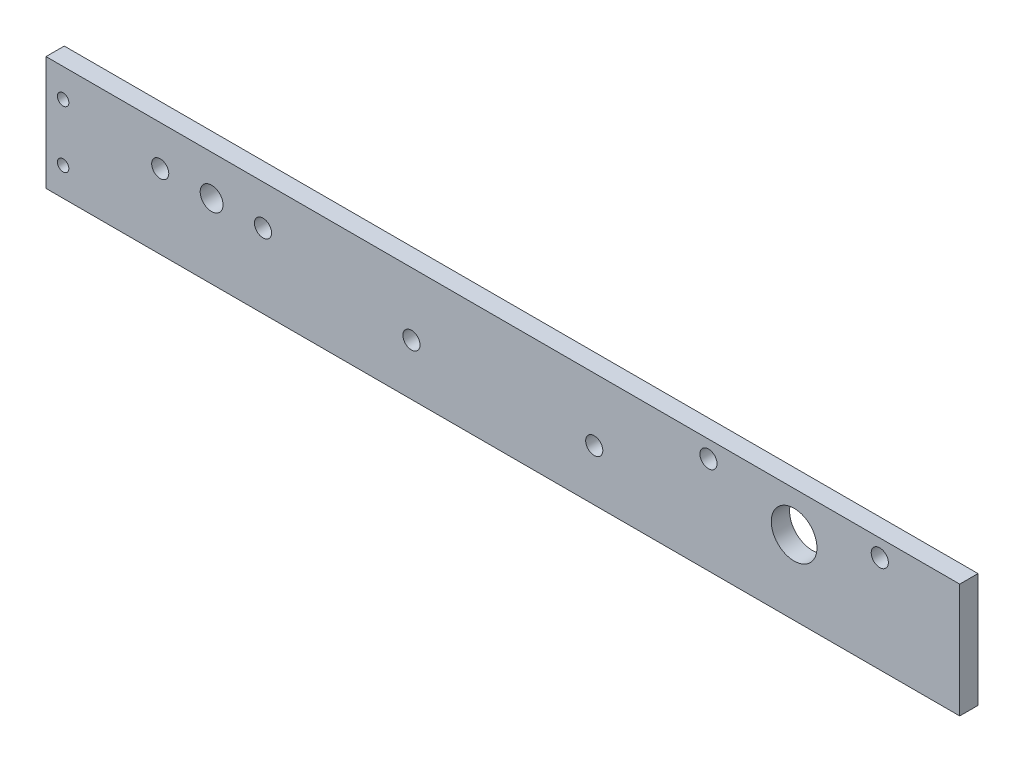
ISO-10303-21;
HEADER;
FILE_DESCRIPTION(('STEP AP214'),'2;1');
FILE_NAME('part.step','',(''),(''),'','','');
FILE_SCHEMA(('AUTOMOTIVE_DESIGN { 1 0 10303 214 1 1 1 1 }'));
ENDSEC;
DATA;
#1=APPLICATION_CONTEXT('core data for automotive mechanical design processes');
#2=APPLICATION_PROTOCOL_DEFINITION('international standard','automotive_design',2000,#1);
#3=PRODUCT_CONTEXT('',#1,'mechanical');
#4=PRODUCT('Part','Part','',(#3));
#5=PRODUCT_RELATED_PRODUCT_CATEGORY('part','',(#4));
#6=PRODUCT_DEFINITION_FORMATION('','',#4);
#7=PRODUCT_DEFINITION_CONTEXT('part definition',#1,'design');
#8=PRODUCT_DEFINITION('design','',#6,#7);
#9=PRODUCT_DEFINITION_SHAPE('','',#8);
#10=(LENGTH_UNIT() NAMED_UNIT(*) SI_UNIT(.MILLI.,.METRE.));
#11=(NAMED_UNIT(*) PLANE_ANGLE_UNIT() SI_UNIT($,.RADIAN.));
#12=(NAMED_UNIT(*) SI_UNIT($,.STERADIAN.) SOLID_ANGLE_UNIT());
#13=UNCERTAINTY_MEASURE_WITH_UNIT(LENGTH_MEASURE(1.E-05),#10,'distance_accuracy_value','');
#14=(GEOMETRIC_REPRESENTATION_CONTEXT(3) GLOBAL_UNCERTAINTY_ASSIGNED_CONTEXT((#13)) GLOBAL_UNIT_ASSIGNED_CONTEXT((#10,
#11,#12)) REPRESENTATION_CONTEXT('',''));
#15=CARTESIAN_POINT('',(0.,0.,0.));
#16=DIRECTION('',(0.,0.,1.));
#17=DIRECTION('',(1.,0.,0.));
#18=AXIS2_PLACEMENT_3D('',#15,#16,#17);
#19=CARTESIAN_POINT('',(0.,0.,6.8));
#20=DIRECTION('',(1.,0.,0.));
#21=DIRECTION('',(0.,0.,-1.));
#22=AXIS2_PLACEMENT_3D('',#19,#20,#21);
#23=PLANE('',#22);
#24=DIRECTION('',(0.,1.,0.));
#25=VECTOR('',#24,1.);
#26=CARTESIAN_POINT('',(0.,0.,10.));
#27=LINE('',#26,#25);
#28=CARTESIAN_POINT('',(0.,-20.,10.));
#29=VERTEX_POINT('',#28);
#30=CARTESIAN_POINT('',(0.,0.,10.));
#31=VERTEX_POINT('',#30);
#32=EDGE_CURVE('E103',#29,#31,#27,.T.);
#33=ORIENTED_EDGE('',*,*,#32,.T.);
#34=DIRECTION('',(0.,0.,1.));
#35=VECTOR('',#34,1.);
#36=CARTESIAN_POINT('',(0.,0.,6.8));
#37=LINE('',#36,#35);
#38=CARTESIAN_POINT('',(0.,0.,6.8));
#39=VERTEX_POINT('',#38);
#40=EDGE_CURVE('E11',#39,#31,#37,.T.);
#41=ORIENTED_EDGE('',*,*,#40,.F.);
#42=DIRECTION('',(0.,1.,0.));
#43=VECTOR('',#42,1.);
#44=CARTESIAN_POINT('',(0.,0.,6.8));
#45=LINE('',#44,#43);
#46=CARTESIAN_POINT('',(0.,-20.,6.8));
#47=VERTEX_POINT('',#46);
#48=EDGE_CURVE('E90',#47,#39,#45,.T.);
#49=ORIENTED_EDGE('',*,*,#48,.F.);
#50=DIRECTION('',(0.,0.,1.));
#51=VECTOR('',#50,1.);
#52=CARTESIAN_POINT('',(0.,-20.,6.8));
#53=LINE('',#52,#51);
#54=EDGE_CURVE('E99',#47,#29,#53,.T.);
#55=ORIENTED_EDGE('',*,*,#54,.T.);
#56=EDGE_LOOP('',(#33,#41,#49,#55));
#57=FACE_BOUND('',#56,.T.);
#58=ADVANCED_FACE('F37',(#57),#23,.F.);
#59=CARTESIAN_POINT('',(0.,0.,6.8));
#60=DIRECTION('',(0.,-1.,0.));
#61=DIRECTION('',(0.,0.,-1.));
#62=AXIS2_PLACEMENT_3D('',#59,#60,#61);
#63=PLANE('',#62);
#64=DIRECTION('',(1.,0.,0.));
#65=VECTOR('',#64,1.);
#66=CARTESIAN_POINT('',(0.,0.,10.));
#67=LINE('',#66,#65);
#68=CARTESIAN_POINT('',(160.,0.,10.));
#69=VERTEX_POINT('',#68);
#70=EDGE_CURVE('E94',#31,#69,#67,.T.);
#71=ORIENTED_EDGE('',*,*,#70,.T.);
#72=DIRECTION('',(0.,0.,1.));
#73=VECTOR('',#72,1.);
#74=CARTESIAN_POINT('',(160.,0.,6.8));
#75=LINE('',#74,#73);
#76=CARTESIAN_POINT('',(160.,0.,6.8));
#77=VERTEX_POINT('',#76);
#78=EDGE_CURVE('E46',#77,#69,#75,.T.);
#79=ORIENTED_EDGE('',*,*,#78,.F.);
#80=DIRECTION('',(1.,0.,0.));
#81=VECTOR('',#80,1.);
#82=CARTESIAN_POINT('',(0.,0.,6.8));
#83=LINE('',#82,#81);
#84=EDGE_CURVE('E85',#39,#77,#83,.T.);
#85=ORIENTED_EDGE('',*,*,#84,.F.);
#86=ORIENTED_EDGE('',*,*,#40,.T.);
#87=EDGE_LOOP('',(#71,#79,#85,#86));
#88=FACE_BOUND('',#87,.T.);
#89=ADVANCED_FACE('F93',(#88),#63,.F.);
#90=CARTESIAN_POINT('',(160.,0.,6.8));
#91=DIRECTION('',(-1.,0.,0.));
#92=DIRECTION('',(0.,0.,1.));
#93=AXIS2_PLACEMENT_3D('',#90,#91,#92);
#94=PLANE('',#93);
#95=DIRECTION('',(0.,-1.,0.));
#96=VECTOR('',#95,1.);
#97=CARTESIAN_POINT('',(160.,0.,10.));
#98=LINE('',#97,#96);
#99=CARTESIAN_POINT('',(160.,-20.,10.));
#100=VERTEX_POINT('',#99);
#101=EDGE_CURVE('E72',#69,#100,#98,.T.);
#102=ORIENTED_EDGE('',*,*,#101,.T.);
#103=DIRECTION('',(0.,0.,1.));
#104=VECTOR('',#103,1.);
#105=CARTESIAN_POINT('',(160.,-20.,6.8));
#106=LINE('',#105,#104);
#107=CARTESIAN_POINT('',(160.,-20.,6.8));
#108=VERTEX_POINT('',#107);
#109=EDGE_CURVE('E95',#108,#100,#106,.T.);
#110=ORIENTED_EDGE('',*,*,#109,.F.);
#111=DIRECTION('',(0.,-1.,0.));
#112=VECTOR('',#111,1.);
#113=CARTESIAN_POINT('',(160.,0.,6.8));
#114=LINE('',#113,#112);
#115=EDGE_CURVE('E88',#77,#108,#114,.T.);
#116=ORIENTED_EDGE('',*,*,#115,.F.);
#117=ORIENTED_EDGE('',*,*,#78,.T.);
#118=EDGE_LOOP('',(#102,#110,#116,#117));
#119=FACE_BOUND('',#118,.T.);
#120=ADVANCED_FACE('F97',(#119),#94,.F.);
#121=CARTESIAN_POINT('',(0.,-20.,6.8));
#122=DIRECTION('',(0.,1.,0.));
#123=DIRECTION('',(0.,0.,1.));
#124=AXIS2_PLACEMENT_3D('',#121,#122,#123);
#125=PLANE('',#124);
#126=DIRECTION('',(-1.,0.,0.));
#127=VECTOR('',#126,1.);
#128=CARTESIAN_POINT('',(0.,-20.,10.));
#129=LINE('',#128,#127);
#130=EDGE_CURVE('E78',#100,#29,#129,.T.);
#131=ORIENTED_EDGE('',*,*,#130,.T.);
#132=ORIENTED_EDGE('',*,*,#54,.F.);
#133=DIRECTION('',(-1.,0.,0.));
#134=VECTOR('',#133,1.);
#135=CARTESIAN_POINT('',(0.,-20.,6.8));
#136=LINE('',#135,#134);
#137=EDGE_CURVE('E55',#108,#47,#136,.T.);
#138=ORIENTED_EDGE('',*,*,#137,.F.);
#139=ORIENTED_EDGE('',*,*,#109,.T.);
#140=EDGE_LOOP('',(#131,#132,#138,#139));
#141=FACE_BOUND('',#140,.T.);
#142=ADVANCED_FACE('F198',(#141),#125,.F.);
#143=CARTESIAN_POINT('',(0.,0.,6.8));
#144=DIRECTION('',(0.,0.,1.));
#145=DIRECTION('',(1.,0.,0.));
#146=AXIS2_PLACEMENT_3D('',#143,#144,#145);
#147=PLANE('',#146);
#148=CARTESIAN_POINT('',(20.,-6.99999999999999,6.8));
#149=DIRECTION('',(0.,0.,-1.));
#150=DIRECTION('',(-1.,0.,0.));
#151=AXIS2_PLACEMENT_3D('',#148,#149,#150);
#152=CIRCLE('',#151,1.5);
#153=CARTESIAN_POINT('',(18.5,-6.99999999999999,6.8));
#154=VERTEX_POINT('',#153);
#155=EDGE_CURVE('E127',#154,#154,#152,.T.);
#156=ORIENTED_EDGE('',*,*,#155,.F.);
#157=EDGE_LOOP('',(#156));
#158=FACE_BOUND('',#157,.T.);
#159=CARTESIAN_POINT('',(38.,-6.99999999999999,6.8));
#160=DIRECTION('',(0.,0.,-1.));
#161=DIRECTION('',(-1.,0.,0.));
#162=AXIS2_PLACEMENT_3D('',#159,#160,#161);
#163=CIRCLE('',#162,1.5);
#164=CARTESIAN_POINT('',(36.5,-6.99999999999999,6.8));
#165=VERTEX_POINT('',#164);
#166=EDGE_CURVE('E133',#165,#165,#163,.T.);
#167=ORIENTED_EDGE('',*,*,#166,.F.);
#168=EDGE_LOOP('',(#167));
#169=FACE_BOUND('',#168,.T.);
#170=CARTESIAN_POINT('',(146.,-3.,6.8));
#171=DIRECTION('',(0.,0.,1.));
#172=DIRECTION('',(1.,0.,0.));
#173=AXIS2_PLACEMENT_3D('',#170,#171,#172);
#174=CIRCLE('',#173,1.5);
#175=CARTESIAN_POINT('',(147.5,-3.,6.8));
#176=VERTEX_POINT('',#175);
#177=EDGE_CURVE('E148',#176,#176,#174,.T.);
#178=ORIENTED_EDGE('',*,*,#177,.T.);
#179=EDGE_LOOP('',(#178));
#180=FACE_BOUND('',#179,.T.);
#181=CARTESIAN_POINT('',(116.,-3.,6.8));
#182=DIRECTION('',(0.,0.,1.));
#183=DIRECTION('',(1.,0.,0.));
#184=AXIS2_PLACEMENT_3D('',#181,#182,#183);
#185=CIRCLE('',#184,1.5);
#186=CARTESIAN_POINT('',(117.5,-3.,6.8));
#187=VERTEX_POINT('',#186);
#188=EDGE_CURVE('E143',#187,#187,#185,.T.);
#189=ORIENTED_EDGE('',*,*,#188,.T.);
#190=EDGE_LOOP('',(#189));
#191=FACE_BOUND('',#190,.T.);
#192=CARTESIAN_POINT('',(2.99999999999999,-15.,6.8));
#193=DIRECTION('',(0.,0.,1.));
#194=DIRECTION('',(1.,0.,0.));
#195=AXIS2_PLACEMENT_3D('',#192,#193,#194);
#196=CIRCLE('',#195,1.);
#197=CARTESIAN_POINT('',(3.99999999999999,-15.,6.8));
#198=VERTEX_POINT('',#197);
#199=EDGE_CURVE('E122',#198,#198,#196,.T.);
#200=ORIENTED_EDGE('',*,*,#199,.T.);
#201=EDGE_LOOP('',(#200));
#202=FACE_BOUND('',#201,.T.);
#203=CARTESIAN_POINT('',(3.,-5.,6.8));
#204=DIRECTION('',(0.,0.,1.));
#205=DIRECTION('',(1.,0.,0.));
#206=AXIS2_PLACEMENT_3D('',#203,#204,#205);
#207=CIRCLE('',#206,1.);
#208=CARTESIAN_POINT('',(4.,-5.,6.8));
#209=VERTEX_POINT('',#208);
#210=EDGE_CURVE('E151',#209,#209,#207,.T.);
#211=ORIENTED_EDGE('',*,*,#210,.T.);
#212=EDGE_LOOP('',(#211));
#213=FACE_BOUND('',#212,.T.);
#214=CARTESIAN_POINT('',(96.,-11.,6.8));
#215=DIRECTION('',(0.,0.,1.));
#216=DIRECTION('',(1.,0.,0.));
#217=AXIS2_PLACEMENT_3D('',#214,#215,#216);
#218=CIRCLE('',#217,1.5);
#219=CARTESIAN_POINT('',(97.5,-11.,6.8));
#220=VERTEX_POINT('',#219);
#221=EDGE_CURVE('E164',#220,#220,#218,.T.);
#222=ORIENTED_EDGE('',*,*,#221,.T.);
#223=EDGE_LOOP('',(#222));
#224=FACE_BOUND('',#223,.T.);
#225=CARTESIAN_POINT('',(64.,-11.,6.8));
#226=DIRECTION('',(0.,0.,1.));
#227=DIRECTION('',(1.,0.,0.));
#228=AXIS2_PLACEMENT_3D('',#225,#226,#227);
#229=CIRCLE('',#228,1.5);
#230=CARTESIAN_POINT('',(65.5,-11.,6.8));
#231=VERTEX_POINT('',#230);
#232=EDGE_CURVE('E159',#231,#231,#229,.T.);
#233=ORIENTED_EDGE('',*,*,#232,.T.);
#234=EDGE_LOOP('',(#233));
#235=FACE_BOUND('',#234,.T.);
#236=CARTESIAN_POINT('',(131.,-7.,6.8));
#237=DIRECTION('',(0.,0.,1.));
#238=DIRECTION('',(1.,0.,0.));
#239=AXIS2_PLACEMENT_3D('',#236,#237,#238);
#240=CIRCLE('',#239,3.99999999999999);
#241=CARTESIAN_POINT('',(135.,-7.,6.8));
#242=VERTEX_POINT('',#241);
#243=EDGE_CURVE('E115',#242,#242,#240,.T.);
#244=ORIENTED_EDGE('',*,*,#243,.T.);
#245=EDGE_LOOP('',(#244));
#246=FACE_BOUND('',#245,.T.);
#247=CARTESIAN_POINT('',(29.,-7.,6.8));
#248=DIRECTION('',(0.,0.,1.));
#249=DIRECTION('',(1.,0.,0.));
#250=AXIS2_PLACEMENT_3D('',#247,#248,#249);
#251=CIRCLE('',#250,2.);
#252=CARTESIAN_POINT('',(31.,-7.,6.8));
#253=VERTEX_POINT('',#252);
#254=EDGE_CURVE('E167',#253,#253,#251,.T.);
#255=ORIENTED_EDGE('',*,*,#254,.T.);
#256=EDGE_LOOP('',(#255));
#257=FACE_BOUND('',#256,.T.);
#258=ORIENTED_EDGE('',*,*,#48,.T.);
#259=ORIENTED_EDGE('',*,*,#84,.T.);
#260=ORIENTED_EDGE('',*,*,#115,.T.);
#261=ORIENTED_EDGE('',*,*,#137,.T.);
#262=EDGE_LOOP('',(#258,#259,#260,#261));
#263=FACE_BOUND('',#262,.T.);
#264=ADVANCED_FACE('F86',(#158,#169,#180,#191,#202,#213,#224,#235,#246,#257,#263),#147,.F.);
#265=CARTESIAN_POINT('',(0.,0.,10.));
#266=DIRECTION('',(0.,0.,1.));
#267=DIRECTION('',(1.,0.,0.));
#268=AXIS2_PLACEMENT_3D('',#265,#266,#267);
#269=PLANE('',#268);
#270=CARTESIAN_POINT('',(20.,-6.99999999999999,10.));
#271=DIRECTION('',(0.,0.,1.));
#272=DIRECTION('',(1.,0.,0.));
#273=AXIS2_PLACEMENT_3D('',#270,#271,#272);
#274=CIRCLE('',#273,1.5);
#275=CARTESIAN_POINT('',(21.5,-6.99999999999999,10.));
#276=VERTEX_POINT('',#275);
#277=EDGE_CURVE('E40',#276,#276,#274,.T.);
#278=ORIENTED_EDGE('',*,*,#277,.F.);
#279=EDGE_LOOP('',(#278));
#280=FACE_BOUND('',#279,.T.);
#281=CARTESIAN_POINT('',(38.,-6.99999999999999,10.));
#282=DIRECTION('',(0.,0.,1.));
#283=DIRECTION('',(1.,0.,0.));
#284=AXIS2_PLACEMENT_3D('',#281,#282,#283);
#285=CIRCLE('',#284,1.5);
#286=CARTESIAN_POINT('',(39.5,-6.99999999999999,10.));
#287=VERTEX_POINT('',#286);
#288=EDGE_CURVE('E125',#287,#287,#285,.T.);
#289=ORIENTED_EDGE('',*,*,#288,.F.);
#290=EDGE_LOOP('',(#289));
#291=FACE_BOUND('',#290,.T.);
#292=CARTESIAN_POINT('',(146.,-3.,10.));
#293=DIRECTION('',(0.,0.,1.));
#294=DIRECTION('',(1.,0.,0.));
#295=AXIS2_PLACEMENT_3D('',#292,#293,#294);
#296=CIRCLE('',#295,1.5);
#297=CARTESIAN_POINT('',(147.5,-3.,10.));
#298=VERTEX_POINT('',#297);
#299=EDGE_CURVE('E140',#298,#298,#296,.T.);
#300=ORIENTED_EDGE('',*,*,#299,.F.);
#301=EDGE_LOOP('',(#300));
#302=FACE_BOUND('',#301,.T.);
#303=CARTESIAN_POINT('',(116.,-3.,10.));
#304=DIRECTION('',(0.,0.,1.));
#305=DIRECTION('',(1.,0.,0.));
#306=AXIS2_PLACEMENT_3D('',#303,#304,#305);
#307=CIRCLE('',#306,1.5);
#308=CARTESIAN_POINT('',(117.5,-3.,10.));
#309=VERTEX_POINT('',#308);
#310=EDGE_CURVE('E131',#309,#309,#307,.T.);
#311=ORIENTED_EDGE('',*,*,#310,.F.);
#312=EDGE_LOOP('',(#311));
#313=FACE_BOUND('',#312,.T.);
#314=CARTESIAN_POINT('',(2.99999999999999,-15.,10.));
#315=DIRECTION('',(0.,0.,1.));
#316=DIRECTION('',(1.,0.,0.));
#317=AXIS2_PLACEMENT_3D('',#314,#315,#316);
#318=CIRCLE('',#317,1.);
#319=CARTESIAN_POINT('',(3.99999999999999,-15.,10.));
#320=VERTEX_POINT('',#319);
#321=EDGE_CURVE('E121',#320,#320,#318,.T.);
#322=ORIENTED_EDGE('',*,*,#321,.F.);
#323=EDGE_LOOP('',(#322));
#324=FACE_BOUND('',#323,.T.);
#325=CARTESIAN_POINT('',(3.,-5.,10.));
#326=DIRECTION('',(0.,0.,1.));
#327=DIRECTION('',(1.,0.,0.));
#328=AXIS2_PLACEMENT_3D('',#325,#326,#327);
#329=CIRCLE('',#328,1.);
#330=CARTESIAN_POINT('',(4.,-5.,10.));
#331=VERTEX_POINT('',#330);
#332=EDGE_CURVE('E118',#331,#331,#329,.T.);
#333=ORIENTED_EDGE('',*,*,#332,.F.);
#334=EDGE_LOOP('',(#333));
#335=FACE_BOUND('',#334,.T.);
#336=CARTESIAN_POINT('',(96.,-11.,10.));
#337=DIRECTION('',(0.,0.,1.));
#338=DIRECTION('',(1.,0.,0.));
#339=AXIS2_PLACEMENT_3D('',#336,#337,#338);
#340=CIRCLE('',#339,1.5);
#341=CARTESIAN_POINT('',(97.5,-11.,10.));
#342=VERTEX_POINT('',#341);
#343=EDGE_CURVE('E156',#342,#342,#340,.T.);
#344=ORIENTED_EDGE('',*,*,#343,.F.);
#345=EDGE_LOOP('',(#344));
#346=FACE_BOUND('',#345,.T.);
#347=CARTESIAN_POINT('',(64.,-11.,10.));
#348=DIRECTION('',(0.,0.,1.));
#349=DIRECTION('',(1.,0.,0.));
#350=AXIS2_PLACEMENT_3D('',#347,#348,#349);
#351=CIRCLE('',#350,1.5);
#352=CARTESIAN_POINT('',(65.5,-11.,10.));
#353=VERTEX_POINT('',#352);
#354=EDGE_CURVE('E124',#353,#353,#351,.T.);
#355=ORIENTED_EDGE('',*,*,#354,.F.);
#356=EDGE_LOOP('',(#355));
#357=FACE_BOUND('',#356,.T.);
#358=CARTESIAN_POINT('',(131.,-7.,10.));
#359=DIRECTION('',(0.,0.,1.));
#360=DIRECTION('',(1.,0.,0.));
#361=AXIS2_PLACEMENT_3D('',#358,#359,#360);
#362=CIRCLE('',#361,3.99999999999999);
#363=CARTESIAN_POINT('',(135.,-7.,10.));
#364=VERTEX_POINT('',#363);
#365=EDGE_CURVE('E106',#364,#364,#362,.T.);
#366=ORIENTED_EDGE('',*,*,#365,.F.);
#367=EDGE_LOOP('',(#366));
#368=FACE_BOUND('',#367,.T.);
#369=CARTESIAN_POINT('',(29.,-7.,10.));
#370=DIRECTION('',(0.,0.,1.));
#371=DIRECTION('',(1.,0.,0.));
#372=AXIS2_PLACEMENT_3D('',#369,#370,#371);
#373=CIRCLE('',#372,2.);
#374=CARTESIAN_POINT('',(31.,-7.,10.));
#375=VERTEX_POINT('',#374);
#376=EDGE_CURVE('E112',#375,#375,#373,.T.);
#377=ORIENTED_EDGE('',*,*,#376,.F.);
#378=EDGE_LOOP('',(#377));
#379=FACE_BOUND('',#378,.T.);
#380=ORIENTED_EDGE('',*,*,#32,.F.);
#381=ORIENTED_EDGE('',*,*,#130,.F.);
#382=ORIENTED_EDGE('',*,*,#101,.F.);
#383=ORIENTED_EDGE('',*,*,#70,.F.);
#384=EDGE_LOOP('',(#380,#381,#382,#383));
#385=FACE_BOUND('',#384,.T.);
#386=ADVANCED_FACE('F177',(#280,#291,#302,#313,#324,#335,#346,#357,#368,#379,#385),#269,.T.);
#387=CARTESIAN_POINT('',(29.,-7.,6.8));
#388=DIRECTION('',(0.,0.,1.));
#389=DIRECTION('',(1.,0.,0.));
#390=AXIS2_PLACEMENT_3D('',#387,#388,#389);
#391=CYLINDRICAL_SURFACE('',#390,2.);
#392=CARTESIAN_POINT('',(31.,-7.,10.));
#393=CARTESIAN_POINT('',(31.,-7.,9.96666666666667));
#394=CARTESIAN_POINT('',(31.,-7.,9.93333333333333));
#395=CARTESIAN_POINT('',(31.,-7.,9.86666666666667));
#396=CARTESIAN_POINT('',(31.,-7.,9.83333333333333));
#397=CARTESIAN_POINT('',(31.,-7.,9.76666666666667));
#398=CARTESIAN_POINT('',(31.,-7.,9.73333333333333));
#399=CARTESIAN_POINT('',(31.,-7.,9.66666666666667));
#400=CARTESIAN_POINT('',(31.,-7.,9.63333333333333));
#401=CARTESIAN_POINT('',(31.,-7.,9.56666666666667));
#402=CARTESIAN_POINT('',(31.,-7.,9.53333333333333));
#403=CARTESIAN_POINT('',(31.,-7.,9.46666666666667));
#404=CARTESIAN_POINT('',(31.,-7.,9.43333333333333));
#405=CARTESIAN_POINT('',(31.,-7.,9.36666666666667));
#406=CARTESIAN_POINT('',(31.,-7.,9.33333333333333));
#407=CARTESIAN_POINT('',(31.,-7.,9.26666666666667));
#408=CARTESIAN_POINT('',(31.,-7.,9.23333333333333));
#409=CARTESIAN_POINT('',(31.,-7.,9.16666666666667));
#410=CARTESIAN_POINT('',(31.,-7.,9.13333333333333));
#411=CARTESIAN_POINT('',(31.,-7.,9.06666666666667));
#412=CARTESIAN_POINT('',(31.,-7.,9.03333333333333));
#413=CARTESIAN_POINT('',(31.,-7.,8.96666666666667));
#414=CARTESIAN_POINT('',(31.,-7.,8.93333333333333));
#415=CARTESIAN_POINT('',(31.,-7.,8.86666666666667));
#416=CARTESIAN_POINT('',(31.,-7.,8.83333333333333));
#417=CARTESIAN_POINT('',(31.,-7.,8.76666666666667));
#418=CARTESIAN_POINT('',(31.,-7.,8.73333333333333));
#419=CARTESIAN_POINT('',(31.,-7.,8.66666666666667));
#420=CARTESIAN_POINT('',(31.,-7.,8.63333333333333));
#421=CARTESIAN_POINT('',(31.,-7.,8.56666666666667));
#422=CARTESIAN_POINT('',(31.,-7.,8.53333333333333));
#423=CARTESIAN_POINT('',(31.,-7.,8.46666666666667));
#424=CARTESIAN_POINT('',(31.,-7.,8.43333333333333));
#425=CARTESIAN_POINT('',(31.,-7.,8.36666666666667));
#426=CARTESIAN_POINT('',(31.,-7.,8.33333333333333));
#427=CARTESIAN_POINT('',(31.,-7.,8.26666666666667));
#428=CARTESIAN_POINT('',(31.,-7.,8.23333333333333));
#429=CARTESIAN_POINT('',(31.,-7.,8.16666666666667));
#430=CARTESIAN_POINT('',(31.,-7.,8.13333333333333));
#431=CARTESIAN_POINT('',(31.,-7.,8.06666666666667));
#432=CARTESIAN_POINT('',(31.,-7.,8.03333333333333));
#433=CARTESIAN_POINT('',(31.,-7.,7.96666666666667));
#434=CARTESIAN_POINT('',(31.,-7.,7.93333333333333));
#435=CARTESIAN_POINT('',(31.,-7.,7.86666666666667));
#436=CARTESIAN_POINT('',(31.,-7.,7.83333333333333));
#437=CARTESIAN_POINT('',(31.,-7.,7.76666666666667));
#438=CARTESIAN_POINT('',(31.,-7.,7.73333333333333));
#439=CARTESIAN_POINT('',(31.,-7.,7.66666666666667));
#440=CARTESIAN_POINT('',(31.,-7.,7.63333333333333));
#441=CARTESIAN_POINT('',(31.,-7.,7.56666666666667));
#442=CARTESIAN_POINT('',(31.,-7.,7.53333333333333));
#443=CARTESIAN_POINT('',(31.,-7.,7.46666666666667));
#444=CARTESIAN_POINT('',(31.,-7.,7.43333333333333));
#445=CARTESIAN_POINT('',(31.,-7.,7.36666666666667));
#446=CARTESIAN_POINT('',(31.,-7.,7.33333333333333));
#447=CARTESIAN_POINT('',(31.,-7.,7.26666666666667));
#448=CARTESIAN_POINT('',(31.,-7.,7.23333333333333));
#449=CARTESIAN_POINT('',(31.,-7.,7.16666666666667));
#450=CARTESIAN_POINT('',(31.,-7.,7.13333333333333));
#451=CARTESIAN_POINT('',(31.,-7.,7.06666666666667));
#452=CARTESIAN_POINT('',(31.,-7.,7.03333333333333));
#453=CARTESIAN_POINT('',(31.,-7.,6.96666666666667));
#454=CARTESIAN_POINT('',(31.,-7.,6.93333333333333));
#455=CARTESIAN_POINT('',(31.,-7.,6.86666666666667));
#456=CARTESIAN_POINT('',(31.,-7.,6.83333333333333));
#457=CARTESIAN_POINT('',(31.,-7.,6.8));
#458=B_SPLINE_CURVE_WITH_KNOTS('',3,(#392,#393,#394,#395,#396,#397,#398,#399,#400,#401,#402,
#403,#404,#405,#406,#407,#408,#409,#410,#411,#412,#413,#414,#415,#416,#417,#418,#419,#420,#421,
#422,#423,#424,#425,#426,#427,#428,#429,#430,#431,#432,#433,#434,#435,#436,#437,#438,#439,#440,
#441,#442,#443,#444,#445,#446,#447,#448,#449,#450,#451,#452,#453,#454,#455,#456,#457),
.UNSPECIFIED.,.F.,.F.,(4,2,2,2,2,2,2,2,2,2,2,2,2,2,2,2,2,2,2,2,2,2,2,2,2,2,2,2,2,2,2,2,4),(0.,
0.100000000000001,0.200000000000001,0.3,0.400000000000001,0.5,0.6,0.700000000000001,0.8,0.9,1.,
1.1,1.2,1.3,1.4,1.5,1.6,1.7,1.8,1.9,2.,2.1,2.2,2.3,2.4,2.5,2.6,2.7,2.8,2.9,3.,3.1,3.2),.UNSPECIFIED.);
#459=EDGE_CURVE('BSEAM174',#375,#253,#458,.T.);
#460=ORIENTED_EDGE('',*,*,#376,.T.);
#461=ORIENTED_EDGE('',*,*,#254,.F.);
#462=ORIENTED_EDGE('',*,*,#459,.T.);
#463=ORIENTED_EDGE('',*,*,#459,.F.);
#464=EDGE_LOOP('',(#460,#462,#461,#463));
#465=FACE_BOUND('',#464,.T.);
#466=ADVANCED_FACE('F174',(#465),#391,.F.);
#467=CARTESIAN_POINT('',(131.,-7.,6.8));
#468=DIRECTION('',(0.,0.,1.));
#469=DIRECTION('',(1.,0.,0.));
#470=AXIS2_PLACEMENT_3D('',#467,#468,#469);
#471=CYLINDRICAL_SURFACE('',#470,3.99999999999999);
#472=CARTESIAN_POINT('',(135.,-7.,10.));
#473=CARTESIAN_POINT('',(135.,-7.,9.96666666666667));
#474=CARTESIAN_POINT('',(135.,-7.,9.93333333333333));
#475=CARTESIAN_POINT('',(135.,-7.,9.86666666666667));
#476=CARTESIAN_POINT('',(135.,-7.,9.83333333333333));
#477=CARTESIAN_POINT('',(135.,-7.,9.76666666666667));
#478=CARTESIAN_POINT('',(135.,-7.,9.73333333333333));
#479=CARTESIAN_POINT('',(135.,-7.,9.66666666666667));
#480=CARTESIAN_POINT('',(135.,-7.,9.63333333333333));
#481=CARTESIAN_POINT('',(135.,-7.,9.56666666666667));
#482=CARTESIAN_POINT('',(135.,-7.,9.53333333333333));
#483=CARTESIAN_POINT('',(135.,-7.,9.46666666666667));
#484=CARTESIAN_POINT('',(135.,-7.,9.43333333333333));
#485=CARTESIAN_POINT('',(135.,-7.,9.36666666666667));
#486=CARTESIAN_POINT('',(135.,-7.,9.33333333333333));
#487=CARTESIAN_POINT('',(135.,-7.,9.26666666666667));
#488=CARTESIAN_POINT('',(135.,-7.,9.23333333333333));
#489=CARTESIAN_POINT('',(135.,-7.,9.16666666666667));
#490=CARTESIAN_POINT('',(135.,-7.,9.13333333333333));
#491=CARTESIAN_POINT('',(135.,-7.,9.06666666666667));
#492=CARTESIAN_POINT('',(135.,-7.,9.03333333333333));
#493=CARTESIAN_POINT('',(135.,-7.,8.96666666666667));
#494=CARTESIAN_POINT('',(135.,-7.,8.93333333333333));
#495=CARTESIAN_POINT('',(135.,-7.,8.86666666666667));
#496=CARTESIAN_POINT('',(135.,-7.,8.83333333333333));
#497=CARTESIAN_POINT('',(135.,-7.,8.76666666666667));
#498=CARTESIAN_POINT('',(135.,-7.,8.73333333333333));
#499=CARTESIAN_POINT('',(135.,-7.,8.66666666666667));
#500=CARTESIAN_POINT('',(135.,-7.,8.63333333333333));
#501=CARTESIAN_POINT('',(135.,-7.,8.56666666666667));
#502=CARTESIAN_POINT('',(135.,-7.,8.53333333333333));
#503=CARTESIAN_POINT('',(135.,-7.,8.46666666666667));
#504=CARTESIAN_POINT('',(135.,-7.,8.43333333333333));
#505=CARTESIAN_POINT('',(135.,-7.,8.36666666666667));
#506=CARTESIAN_POINT('',(135.,-7.,8.33333333333333));
#507=CARTESIAN_POINT('',(135.,-7.,8.26666666666667));
#508=CARTESIAN_POINT('',(135.,-7.,8.23333333333333));
#509=CARTESIAN_POINT('',(135.,-7.,8.16666666666667));
#510=CARTESIAN_POINT('',(135.,-7.,8.13333333333333));
#511=CARTESIAN_POINT('',(135.,-7.,8.06666666666667));
#512=CARTESIAN_POINT('',(135.,-7.,8.03333333333333));
#513=CARTESIAN_POINT('',(135.,-7.,7.96666666666667));
#514=CARTESIAN_POINT('',(135.,-7.,7.93333333333333));
#515=CARTESIAN_POINT('',(135.,-7.,7.86666666666667));
#516=CARTESIAN_POINT('',(135.,-7.,7.83333333333333));
#517=CARTESIAN_POINT('',(135.,-7.,7.76666666666667));
#518=CARTESIAN_POINT('',(135.,-7.,7.73333333333333));
#519=CARTESIAN_POINT('',(135.,-7.,7.66666666666667));
#520=CARTESIAN_POINT('',(135.,-7.,7.63333333333333));
#521=CARTESIAN_POINT('',(135.,-7.,7.56666666666667));
#522=CARTESIAN_POINT('',(135.,-7.,7.53333333333333));
#523=CARTESIAN_POINT('',(135.,-7.,7.46666666666667));
#524=CARTESIAN_POINT('',(135.,-7.,7.43333333333333));
#525=CARTESIAN_POINT('',(135.,-7.,7.36666666666667));
#526=CARTESIAN_POINT('',(135.,-7.,7.33333333333333));
#527=CARTESIAN_POINT('',(135.,-7.,7.26666666666667));
#528=CARTESIAN_POINT('',(135.,-7.,7.23333333333333));
#529=CARTESIAN_POINT('',(135.,-7.,7.16666666666667));
#530=CARTESIAN_POINT('',(135.,-7.,7.13333333333333));
#531=CARTESIAN_POINT('',(135.,-7.,7.06666666666667));
#532=CARTESIAN_POINT('',(135.,-7.,7.03333333333333));
#533=CARTESIAN_POINT('',(135.,-7.,6.96666666666667));
#534=CARTESIAN_POINT('',(135.,-7.,6.93333333333333));
#535=CARTESIAN_POINT('',(135.,-7.,6.86666666666667));
#536=CARTESIAN_POINT('',(135.,-7.,6.83333333333333));
#537=CARTESIAN_POINT('',(135.,-7.,6.8));
#538=B_SPLINE_CURVE_WITH_KNOTS('',3,(#472,#473,#474,#475,#476,#477,#478,#479,#480,#481,#482,
#483,#484,#485,#486,#487,#488,#489,#490,#491,#492,#493,#494,#495,#496,#497,#498,#499,#500,#501,
#502,#503,#504,#505,#506,#507,#508,#509,#510,#511,#512,#513,#514,#515,#516,#517,#518,#519,#520,
#521,#522,#523,#524,#525,#526,#527,#528,#529,#530,#531,#532,#533,#534,#535,#536,#537),
.UNSPECIFIED.,.F.,.F.,(4,2,2,2,2,2,2,2,2,2,2,2,2,2,2,2,2,2,2,2,2,2,2,2,2,2,2,2,2,2,2,2,4),(0.,
0.100000000000001,0.200000000000001,0.3,0.400000000000001,0.5,0.6,0.700000000000001,0.8,0.9,1.,
1.1,1.2,1.3,1.4,1.5,1.6,1.7,1.8,1.9,2.,2.1,2.2,2.3,2.4,2.5,2.6,2.7,2.8,2.9,3.,3.1,3.2),.UNSPECIFIED.);
#539=EDGE_CURVE('BSEAM176',#364,#242,#538,.T.);
#540=ORIENTED_EDGE('',*,*,#365,.T.);
#541=ORIENTED_EDGE('',*,*,#243,.F.);
#542=ORIENTED_EDGE('',*,*,#539,.T.);
#543=ORIENTED_EDGE('',*,*,#539,.F.);
#544=EDGE_LOOP('',(#540,#542,#541,#543));
#545=FACE_BOUND('',#544,.T.);
#546=ADVANCED_FACE('F176',(#545),#471,.F.);
#547=CARTESIAN_POINT('',(64.,-11.,0.));
#548=DIRECTION('',(0.,0.,1.));
#549=DIRECTION('',(1.,0.,0.));
#550=AXIS2_PLACEMENT_3D('',#547,#548,#549);
#551=CYLINDRICAL_SURFACE('',#550,1.5);
#552=ORIENTED_EDGE('',*,*,#354,.T.);
#553=EDGE_LOOP('',(#552));
#554=FACE_BOUND('',#553,.T.);
#555=ORIENTED_EDGE('',*,*,#232,.F.);
#556=EDGE_LOOP('',(#555));
#557=FACE_BOUND('',#556,.T.);
#558=ADVANCED_FACE('F184',(#554,#557),#551,.F.);
#559=CARTESIAN_POINT('',(96.,-11.,0.));
#560=DIRECTION('',(0.,0.,1.));
#561=DIRECTION('',(1.,0.,0.));
#562=AXIS2_PLACEMENT_3D('',#559,#560,#561);
#563=CYLINDRICAL_SURFACE('',#562,1.5);
#564=ORIENTED_EDGE('',*,*,#343,.T.);
#565=EDGE_LOOP('',(#564));
#566=FACE_BOUND('',#565,.T.);
#567=ORIENTED_EDGE('',*,*,#221,.F.);
#568=EDGE_LOOP('',(#567));
#569=FACE_BOUND('',#568,.T.);
#570=ADVANCED_FACE('F251',(#566,#569),#563,.F.);
#571=CARTESIAN_POINT('',(3.,-5.,6.8));
#572=DIRECTION('',(0.,0.,1.));
#573=DIRECTION('',(1.,0.,0.));
#574=AXIS2_PLACEMENT_3D('',#571,#572,#573);
#575=CYLINDRICAL_SURFACE('',#574,1.);
#576=CARTESIAN_POINT('',(4.,-5.,10.));
#577=CARTESIAN_POINT('',(4.,-5.,9.96666666666667));
#578=CARTESIAN_POINT('',(4.,-5.,9.93333333333333));
#579=CARTESIAN_POINT('',(4.,-5.,9.86666666666667));
#580=CARTESIAN_POINT('',(4.,-5.,9.83333333333333));
#581=CARTESIAN_POINT('',(4.,-5.,9.76666666666667));
#582=CARTESIAN_POINT('',(4.,-5.,9.73333333333333));
#583=CARTESIAN_POINT('',(4.,-5.,9.66666666666667));
#584=CARTESIAN_POINT('',(4.,-5.,9.63333333333333));
#585=CARTESIAN_POINT('',(4.,-5.,9.56666666666667));
#586=CARTESIAN_POINT('',(4.,-5.,9.53333333333333));
#587=CARTESIAN_POINT('',(4.,-5.,9.46666666666667));
#588=CARTESIAN_POINT('',(4.,-5.,9.43333333333333));
#589=CARTESIAN_POINT('',(4.,-5.,9.36666666666667));
#590=CARTESIAN_POINT('',(4.,-5.,9.33333333333333));
#591=CARTESIAN_POINT('',(4.,-5.,9.26666666666667));
#592=CARTESIAN_POINT('',(4.,-5.,9.23333333333333));
#593=CARTESIAN_POINT('',(4.,-5.,9.16666666666667));
#594=CARTESIAN_POINT('',(4.,-5.,9.13333333333333));
#595=CARTESIAN_POINT('',(4.,-5.,9.06666666666667));
#596=CARTESIAN_POINT('',(4.,-5.,9.03333333333333));
#597=CARTESIAN_POINT('',(4.,-5.,8.96666666666667));
#598=CARTESIAN_POINT('',(4.,-5.,8.93333333333333));
#599=CARTESIAN_POINT('',(4.,-5.,8.86666666666667));
#600=CARTESIAN_POINT('',(4.,-5.,8.83333333333333));
#601=CARTESIAN_POINT('',(4.,-5.,8.76666666666667));
#602=CARTESIAN_POINT('',(4.,-5.,8.73333333333333));
#603=CARTESIAN_POINT('',(4.,-5.,8.66666666666667));
#604=CARTESIAN_POINT('',(4.,-5.,8.63333333333333));
#605=CARTESIAN_POINT('',(4.,-5.,8.56666666666667));
#606=CARTESIAN_POINT('',(4.,-5.,8.53333333333333));
#607=CARTESIAN_POINT('',(4.,-5.,8.46666666666667));
#608=CARTESIAN_POINT('',(4.,-5.,8.43333333333333));
#609=CARTESIAN_POINT('',(4.,-5.,8.36666666666667));
#610=CARTESIAN_POINT('',(4.,-5.,8.33333333333333));
#611=CARTESIAN_POINT('',(4.,-5.,8.26666666666667));
#612=CARTESIAN_POINT('',(4.,-5.,8.23333333333333));
#613=CARTESIAN_POINT('',(4.,-5.,8.16666666666667));
#614=CARTESIAN_POINT('',(4.,-5.,8.13333333333333));
#615=CARTESIAN_POINT('',(4.,-5.,8.06666666666667));
#616=CARTESIAN_POINT('',(4.,-5.,8.03333333333333));
#617=CARTESIAN_POINT('',(4.,-5.,7.96666666666667));
#618=CARTESIAN_POINT('',(4.,-5.,7.93333333333333));
#619=CARTESIAN_POINT('',(4.,-5.,7.86666666666667));
#620=CARTESIAN_POINT('',(4.,-5.,7.83333333333333));
#621=CARTESIAN_POINT('',(4.,-5.,7.76666666666667));
#622=CARTESIAN_POINT('',(4.,-5.,7.73333333333333));
#623=CARTESIAN_POINT('',(4.,-5.,7.66666666666667));
#624=CARTESIAN_POINT('',(4.,-5.,7.63333333333333));
#625=CARTESIAN_POINT('',(4.,-5.,7.56666666666667));
#626=CARTESIAN_POINT('',(4.,-5.,7.53333333333333));
#627=CARTESIAN_POINT('',(4.,-5.,7.46666666666667));
#628=CARTESIAN_POINT('',(4.,-5.,7.43333333333333));
#629=CARTESIAN_POINT('',(4.,-5.,7.36666666666667));
#630=CARTESIAN_POINT('',(4.,-5.,7.33333333333333));
#631=CARTESIAN_POINT('',(4.,-5.,7.26666666666667));
#632=CARTESIAN_POINT('',(4.,-5.,7.23333333333333));
#633=CARTESIAN_POINT('',(4.,-5.,7.16666666666667));
#634=CARTESIAN_POINT('',(4.,-5.,7.13333333333333));
#635=CARTESIAN_POINT('',(4.,-5.,7.06666666666667));
#636=CARTESIAN_POINT('',(4.,-5.,7.03333333333333));
#637=CARTESIAN_POINT('',(4.,-5.,6.96666666666667));
#638=CARTESIAN_POINT('',(4.,-5.,6.93333333333333));
#639=CARTESIAN_POINT('',(4.,-5.,6.86666666666667));
#640=CARTESIAN_POINT('',(4.,-5.,6.83333333333333));
#641=CARTESIAN_POINT('',(4.,-5.,6.8));
#642=B_SPLINE_CURVE_WITH_KNOTS('',3,(#576,#577,#578,#579,#580,#581,#582,#583,#584,#585,#586,
#587,#588,#589,#590,#591,#592,#593,#594,#595,#596,#597,#598,#599,#600,#601,#602,#603,#604,#605,
#606,#607,#608,#609,#610,#611,#612,#613,#614,#615,#616,#617,#618,#619,#620,#621,#622,#623,#624,
#625,#626,#627,#628,#629,#630,#631,#632,#633,#634,#635,#636,#637,#638,#639,#640,#641),
.UNSPECIFIED.,.F.,.F.,(4,2,2,2,2,2,2,2,2,2,2,2,2,2,2,2,2,2,2,2,2,2,2,2,2,2,2,2,2,2,2,2,4),(0.,
0.100000000000001,0.200000000000001,0.3,0.400000000000001,0.5,0.6,0.700000000000001,0.8,0.9,1.,
1.1,1.2,1.3,1.4,1.5,1.6,1.7,1.8,1.9,2.,2.1,2.2,2.3,2.4,2.5,2.6,2.7,2.8,2.9,3.,3.1,3.2),.UNSPECIFIED.);
#643=EDGE_CURVE('BSEAM260',#331,#209,#642,.T.);
#644=ORIENTED_EDGE('',*,*,#332,.T.);
#645=ORIENTED_EDGE('',*,*,#210,.F.);
#646=ORIENTED_EDGE('',*,*,#643,.T.);
#647=ORIENTED_EDGE('',*,*,#643,.F.);
#648=EDGE_LOOP('',(#644,#646,#645,#647));
#649=FACE_BOUND('',#648,.T.);
#650=ADVANCED_FACE('F260',(#649),#575,.F.);
#651=CARTESIAN_POINT('',(2.99999999999999,-15.,6.8));
#652=DIRECTION('',(0.,0.,1.));
#653=DIRECTION('',(1.,0.,0.));
#654=AXIS2_PLACEMENT_3D('',#651,#652,#653);
#655=CYLINDRICAL_SURFACE('',#654,1.);
#656=CARTESIAN_POINT('',(3.99999999999999,-15.,10.));
#657=CARTESIAN_POINT('',(3.99999999999999,-15.,9.96666666666667));
#658=CARTESIAN_POINT('',(3.99999999999999,-15.,9.93333333333333));
#659=CARTESIAN_POINT('',(3.99999999999999,-15.,9.86666666666667));
#660=CARTESIAN_POINT('',(3.99999999999999,-15.,9.83333333333333));
#661=CARTESIAN_POINT('',(3.99999999999999,-15.,9.76666666666667));
#662=CARTESIAN_POINT('',(3.99999999999999,-15.,9.73333333333333));
#663=CARTESIAN_POINT('',(3.99999999999999,-15.,9.66666666666667));
#664=CARTESIAN_POINT('',(3.99999999999999,-15.,9.63333333333333));
#665=CARTESIAN_POINT('',(3.99999999999999,-15.,9.56666666666667));
#666=CARTESIAN_POINT('',(3.99999999999999,-15.,9.53333333333333));
#667=CARTESIAN_POINT('',(3.99999999999999,-15.,9.46666666666667));
#668=CARTESIAN_POINT('',(3.99999999999999,-15.,9.43333333333333));
#669=CARTESIAN_POINT('',(3.99999999999999,-15.,9.36666666666667));
#670=CARTESIAN_POINT('',(3.99999999999999,-15.,9.33333333333333));
#671=CARTESIAN_POINT('',(3.99999999999999,-15.,9.26666666666667));
#672=CARTESIAN_POINT('',(3.99999999999999,-15.,9.23333333333333));
#673=CARTESIAN_POINT('',(3.99999999999999,-15.,9.16666666666667));
#674=CARTESIAN_POINT('',(3.99999999999999,-15.,9.13333333333333));
#675=CARTESIAN_POINT('',(3.99999999999999,-15.,9.06666666666667));
#676=CARTESIAN_POINT('',(3.99999999999999,-15.,9.03333333333333));
#677=CARTESIAN_POINT('',(3.99999999999999,-15.,8.96666666666667));
#678=CARTESIAN_POINT('',(3.99999999999999,-15.,8.93333333333333));
#679=CARTESIAN_POINT('',(3.99999999999999,-15.,8.86666666666667));
#680=CARTESIAN_POINT('',(3.99999999999999,-15.,8.83333333333333));
#681=CARTESIAN_POINT('',(3.99999999999999,-15.,8.76666666666667));
#682=CARTESIAN_POINT('',(3.99999999999999,-15.,8.73333333333333));
#683=CARTESIAN_POINT('',(3.99999999999999,-15.,8.66666666666667));
#684=CARTESIAN_POINT('',(3.99999999999999,-15.,8.63333333333333));
#685=CARTESIAN_POINT('',(3.99999999999999,-15.,8.56666666666667));
#686=CARTESIAN_POINT('',(3.99999999999999,-15.,8.53333333333333));
#687=CARTESIAN_POINT('',(3.99999999999999,-15.,8.46666666666667));
#688=CARTESIAN_POINT('',(3.99999999999999,-15.,8.43333333333333));
#689=CARTESIAN_POINT('',(3.99999999999999,-15.,8.36666666666667));
#690=CARTESIAN_POINT('',(3.99999999999999,-15.,8.33333333333333));
#691=CARTESIAN_POINT('',(3.99999999999999,-15.,8.26666666666667));
#692=CARTESIAN_POINT('',(3.99999999999999,-15.,8.23333333333333));
#693=CARTESIAN_POINT('',(3.99999999999999,-15.,8.16666666666667));
#694=CARTESIAN_POINT('',(3.99999999999999,-15.,8.13333333333333));
#695=CARTESIAN_POINT('',(3.99999999999999,-15.,8.06666666666667));
#696=CARTESIAN_POINT('',(3.99999999999999,-15.,8.03333333333333));
#697=CARTESIAN_POINT('',(3.99999999999999,-15.,7.96666666666667));
#698=CARTESIAN_POINT('',(3.99999999999999,-15.,7.93333333333333));
#699=CARTESIAN_POINT('',(3.99999999999999,-15.,7.86666666666667));
#700=CARTESIAN_POINT('',(3.99999999999999,-15.,7.83333333333333));
#701=CARTESIAN_POINT('',(3.99999999999999,-15.,7.76666666666667));
#702=CARTESIAN_POINT('',(3.99999999999999,-15.,7.73333333333333));
#703=CARTESIAN_POINT('',(3.99999999999999,-15.,7.66666666666667));
#704=CARTESIAN_POINT('',(3.99999999999999,-15.,7.63333333333333));
#705=CARTESIAN_POINT('',(3.99999999999999,-15.,7.56666666666667));
#706=CARTESIAN_POINT('',(3.99999999999999,-15.,7.53333333333333));
#707=CARTESIAN_POINT('',(3.99999999999999,-15.,7.46666666666667));
#708=CARTESIAN_POINT('',(3.99999999999999,-15.,7.43333333333333));
#709=CARTESIAN_POINT('',(3.99999999999999,-15.,7.36666666666667));
#710=CARTESIAN_POINT('',(3.99999999999999,-15.,7.33333333333333));
#711=CARTESIAN_POINT('',(3.99999999999999,-15.,7.26666666666667));
#712=CARTESIAN_POINT('',(3.99999999999999,-15.,7.23333333333333));
#713=CARTESIAN_POINT('',(3.99999999999999,-15.,7.16666666666667));
#714=CARTESIAN_POINT('',(3.99999999999999,-15.,7.13333333333333));
#715=CARTESIAN_POINT('',(3.99999999999999,-15.,7.06666666666667));
#716=CARTESIAN_POINT('',(3.99999999999999,-15.,7.03333333333333));
#717=CARTESIAN_POINT('',(3.99999999999999,-15.,6.96666666666667));
#718=CARTESIAN_POINT('',(3.99999999999999,-15.,6.93333333333333));
#719=CARTESIAN_POINT('',(3.99999999999999,-15.,6.86666666666667));
#720=CARTESIAN_POINT('',(3.99999999999999,-15.,6.83333333333333));
#721=CARTESIAN_POINT('',(3.99999999999999,-15.,6.8));
#722=B_SPLINE_CURVE_WITH_KNOTS('',3,(#656,#657,#658,#659,#660,#661,#662,#663,#664,#665,#666,
#667,#668,#669,#670,#671,#672,#673,#674,#675,#676,#677,#678,#679,#680,#681,#682,#683,#684,#685,
#686,#687,#688,#689,#690,#691,#692,#693,#694,#695,#696,#697,#698,#699,#700,#701,#702,#703,#704,
#705,#706,#707,#708,#709,#710,#711,#712,#713,#714,#715,#716,#717,#718,#719,#720,#721),
.UNSPECIFIED.,.F.,.F.,(4,2,2,2,2,2,2,2,2,2,2,2,2,2,2,2,2,2,2,2,2,2,2,2,2,2,2,2,2,2,2,2,4),(0.,
0.100000000000001,0.200000000000001,0.3,0.400000000000001,0.5,0.6,0.700000000000001,0.8,0.9,1.,
1.1,1.2,1.3,1.4,1.5,1.6,1.7,1.8,1.9,2.,2.1,2.2,2.3,2.4,2.5,2.6,2.7,2.8,2.9,3.,3.1,3.2),.UNSPECIFIED.);
#723=EDGE_CURVE('BSEAM269',#320,#198,#722,.T.);
#724=ORIENTED_EDGE('',*,*,#321,.T.);
#725=ORIENTED_EDGE('',*,*,#199,.F.);
#726=ORIENTED_EDGE('',*,*,#723,.T.);
#727=ORIENTED_EDGE('',*,*,#723,.F.);
#728=EDGE_LOOP('',(#724,#726,#725,#727));
#729=FACE_BOUND('',#728,.T.);
#730=ADVANCED_FACE('F269',(#729),#655,.F.);
#731=CARTESIAN_POINT('',(116.,-3.,0.));
#732=DIRECTION('',(0.,0.,1.));
#733=DIRECTION('',(1.,0.,0.));
#734=AXIS2_PLACEMENT_3D('',#731,#732,#733);
#735=CYLINDRICAL_SURFACE('',#734,1.5);
#736=ORIENTED_EDGE('',*,*,#310,.T.);
#737=EDGE_LOOP('',(#736));
#738=FACE_BOUND('',#737,.T.);
#739=ORIENTED_EDGE('',*,*,#188,.F.);
#740=EDGE_LOOP('',(#739));
#741=FACE_BOUND('',#740,.T.);
#742=ADVANCED_FACE('F278',(#738,#741),#735,.F.);
#743=CARTESIAN_POINT('',(146.,-3.,0.));
#744=DIRECTION('',(0.,0.,1.));
#745=DIRECTION('',(1.,0.,0.));
#746=AXIS2_PLACEMENT_3D('',#743,#744,#745);
#747=CYLINDRICAL_SURFACE('',#746,1.5);
#748=ORIENTED_EDGE('',*,*,#299,.T.);
#749=EDGE_LOOP('',(#748));
#750=FACE_BOUND('',#749,.T.);
#751=ORIENTED_EDGE('',*,*,#177,.F.);
#752=EDGE_LOOP('',(#751));
#753=FACE_BOUND('',#752,.T.);
#754=ADVANCED_FACE('F287',(#750,#753),#747,.F.);
#755=CARTESIAN_POINT('',(38.,-6.99999999999999,16.8));
#756=DIRECTION('',(0.,0.,-1.));
#757=DIRECTION('',(-1.,0.,0.));
#758=AXIS2_PLACEMENT_3D('',#755,#756,#757);
#759=CYLINDRICAL_SURFACE('',#758,1.5);
#760=ORIENTED_EDGE('',*,*,#288,.T.);
#761=EDGE_LOOP('',(#760));
#762=FACE_BOUND('',#761,.T.);
#763=ORIENTED_EDGE('',*,*,#166,.T.);
#764=EDGE_LOOP('',(#763));
#765=FACE_BOUND('',#764,.T.);
#766=ADVANCED_FACE('F296',(#762,#765),#759,.F.);
#767=CARTESIAN_POINT('',(20.,-6.99999999999999,16.8));
#768=DIRECTION('',(0.,0.,-1.));
#769=DIRECTION('',(-1.,0.,0.));
#770=AXIS2_PLACEMENT_3D('',#767,#768,#769);
#771=CYLINDRICAL_SURFACE('',#770,1.5);
#772=ORIENTED_EDGE('',*,*,#277,.T.);
#773=EDGE_LOOP('',(#772));
#774=FACE_BOUND('',#773,.T.);
#775=ORIENTED_EDGE('',*,*,#155,.T.);
#776=EDGE_LOOP('',(#775));
#777=FACE_BOUND('',#776,.T.);
#778=ADVANCED_FACE('F305',(#774,#777),#771,.F.);
#779=CLOSED_SHELL('',(#58,#89,#120,#142,#264,#386,#466,#546,#558,#570,#650,#730,#742,#754,#766,#778));
#780=MANIFOLD_SOLID_BREP('B2',#779);
#781=ADVANCED_BREP_SHAPE_REPRESENTATION('',(#18,#780),#14);
#782=SHAPE_DEFINITION_REPRESENTATION(#9,#781);
ENDSEC;
END-ISO-10303-21;
